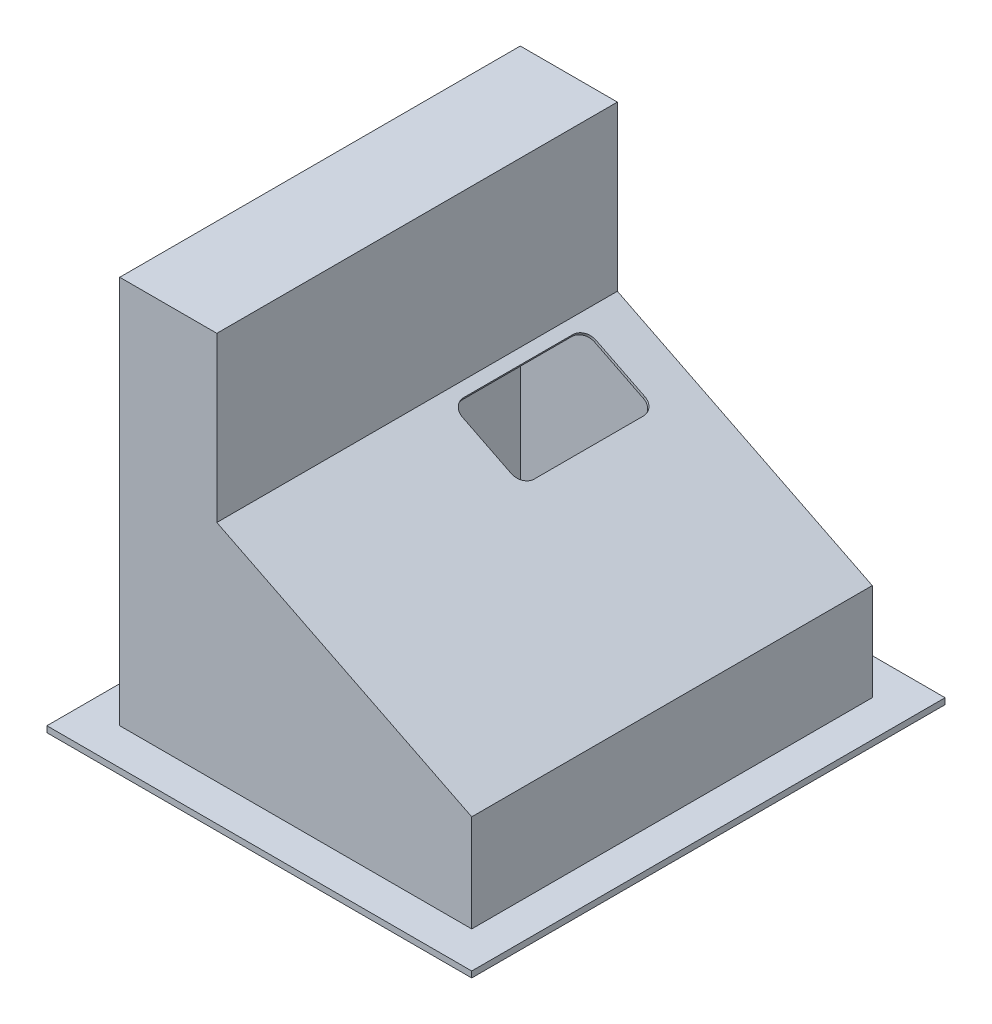
ISO-10303-21;
HEADER;
FILE_DESCRIPTION(('STEP AP214'),'2;1');
FILE_NAME('part.step','',(''),(''),'','','');
FILE_SCHEMA(('AUTOMOTIVE_DESIGN { 1 0 10303 214 1 1 1 1 }'));
ENDSEC;
DATA;
#1=APPLICATION_CONTEXT('core data for automotive mechanical design processes');
#2=APPLICATION_PROTOCOL_DEFINITION('international standard','automotive_design',2000,#1);
#3=PRODUCT_CONTEXT('',#1,'mechanical');
#4=PRODUCT('Part','Part','',(#3));
#5=PRODUCT_RELATED_PRODUCT_CATEGORY('part','',(#4));
#6=PRODUCT_DEFINITION_FORMATION('','',#4);
#7=PRODUCT_DEFINITION_CONTEXT('part definition',#1,'design');
#8=PRODUCT_DEFINITION('design','',#6,#7);
#9=PRODUCT_DEFINITION_SHAPE('','',#8);
#10=(LENGTH_UNIT() NAMED_UNIT(*) SI_UNIT(.MILLI.,.METRE.));
#11=(NAMED_UNIT(*) PLANE_ANGLE_UNIT() SI_UNIT($,.RADIAN.));
#12=(NAMED_UNIT(*) SI_UNIT($,.STERADIAN.) SOLID_ANGLE_UNIT());
#13=UNCERTAINTY_MEASURE_WITH_UNIT(LENGTH_MEASURE(1.E-05),#10,'distance_accuracy_value','');
#14=(GEOMETRIC_REPRESENTATION_CONTEXT(3) GLOBAL_UNCERTAINTY_ASSIGNED_CONTEXT((#13)) GLOBAL_UNIT_ASSIGNED_CONTEXT((#10,
#11,#12)) REPRESENTATION_CONTEXT('',''));
#15=CARTESIAN_POINT('',(0.,0.,0.));
#16=DIRECTION('',(0.,0.,1.));
#17=DIRECTION('',(1.,0.,0.));
#18=AXIS2_PLACEMENT_3D('',#15,#16,#17);
#19=CARTESIAN_POINT('',(33.3375,58.7375,101.6));
#20=DIRECTION('',(0.447213595499958,0.894427190999916,0.));
#21=DIRECTION('',(-0.894427190999916,0.447213595499958,0.));
#22=AXIS2_PLACEMENT_3D('',#19,#20,#21);
#23=PLANE('',#22);
#24=DIRECTION('',(0.,0.,1.));
#25=VECTOR('',#24,1.);
#26=CARTESIAN_POINT('',(37.2620158285617,56.7752420857191,101.6));
#27=LINE('',#26,#25);
#28=CARTESIAN_POINT('',(37.2620158285618,56.7752420857191,12.7));
#29=VERTEX_POINT('',#28);
#30=CARTESIAN_POINT('',(37.2620158285618,56.7752420857191,41.275));
#31=VERTEX_POINT('',#30);
#32=EDGE_CURVE('E273',#29,#31,#27,.T.);
#33=ORIENTED_EDGE('',*,*,#32,.T.);
#34=CARTESIAN_POINT('',(40.1018221599866,55.3553389200067,41.275));
#35=DIRECTION('',(0.447213595499958,0.894427190999916,0.));
#36=DIRECTION('',(-0.894427190999916,0.447213595499958,0.));
#37=AXIS2_PLACEMENT_3D('',#34,#35,#36);
#38=CIRCLE('',#37,3.17500000000007);
#39=CARTESIAN_POINT('',(40.1018221599866,55.3553389200067,44.45));
#40=VERTEX_POINT('',#39);
#41=EDGE_CURVE('E270',#31,#40,#38,.T.);
#42=ORIENTED_EDGE('',*,*,#41,.T.);
#43=DIRECTION('',(0.894427190999916,-0.447213595499958,0.));
#44=VECTOR('',#43,1.);
#45=CARTESIAN_POINT('',(33.3374999999998,58.7375000000001,44.4500000000001));
#46=LINE('',#45,#44);
#47=CARTESIAN_POINT('',(52.8809506513979,48.9657746743011,44.45));
#48=VERTEX_POINT('',#47);
#49=EDGE_CURVE('E278',#40,#48,#46,.T.);
#50=ORIENTED_EDGE('',*,*,#49,.T.);
#51=CARTESIAN_POINT('',(52.8809506513979,48.9657746743011,41.275));
#52=DIRECTION('',(0.447213595499958,0.894427190999916,0.));
#53=DIRECTION('',(-0.894427190999916,0.447213595499958,0.));
#54=AXIS2_PLACEMENT_3D('',#51,#52,#53);
#55=CIRCLE('',#54,3.17500000000001);
#56=CARTESIAN_POINT('',(55.7207569828226,47.5458715085887,41.275));
#57=VERTEX_POINT('',#56);
#58=EDGE_CURVE('E276',#48,#57,#55,.T.);
#59=ORIENTED_EDGE('',*,*,#58,.T.);
#60=DIRECTION('',(0.,0.,-1.));
#61=VECTOR('',#60,1.);
#62=CARTESIAN_POINT('',(55.7207569828226,47.5458715085887,101.6));
#63=LINE('',#62,#61);
#64=CARTESIAN_POINT('',(55.7207569828226,47.5458715085887,12.7));
#65=VERTEX_POINT('',#64);
#66=EDGE_CURVE('E213',#57,#65,#63,.T.);
#67=ORIENTED_EDGE('',*,*,#66,.T.);
#68=CARTESIAN_POINT('',(52.8809506513979,48.9657746743011,12.7));
#69=DIRECTION('',(0.447213595499958,0.894427190999916,0.));
#70=DIRECTION('',(-0.894427190999916,0.447213595499958,0.));
#71=AXIS2_PLACEMENT_3D('',#68,#69,#70);
#72=CIRCLE('',#71,3.17500000000001);
#73=CARTESIAN_POINT('',(52.8809506513979,48.9657746743011,9.525));
#74=VERTEX_POINT('',#73);
#75=EDGE_CURVE('E250',#65,#74,#72,.T.);
#76=ORIENTED_EDGE('',*,*,#75,.T.);
#77=DIRECTION('',(-0.894427190999916,0.447213595499958,0.));
#78=VECTOR('',#77,1.);
#79=CARTESIAN_POINT('',(33.3375,58.7375,9.52500000000001));
#80=LINE('',#79,#78);
#81=CARTESIAN_POINT('',(40.1018221599866,55.3553389200067,9.525));
#82=VERTEX_POINT('',#81);
#83=EDGE_CURVE('E264',#74,#82,#80,.T.);
#84=ORIENTED_EDGE('',*,*,#83,.T.);
#85=CARTESIAN_POINT('',(40.1018221599866,55.3553389200067,12.7));
#86=DIRECTION('',(0.447213595499958,0.894427190999916,0.));
#87=DIRECTION('',(-0.894427190999916,0.447213595499958,0.));
#88=AXIS2_PLACEMENT_3D('',#85,#86,#87);
#89=CIRCLE('',#88,3.175);
#90=EDGE_CURVE('E267',#82,#29,#89,.T.);
#91=ORIENTED_EDGE('',*,*,#90,.T.);
#92=EDGE_LOOP('',(#33,#42,#50,#59,#67,#76,#84,#91));
#93=FACE_BOUND('',#92,.T.);
#94=DIRECTION('',(0.,0.,-1.));
#95=VECTOR('',#94,1.);
#96=CARTESIAN_POINT('',(97.8375144127702,26.4874927936149,101.6));
#97=LINE('',#96,#95);
#98=CARTESIAN_POINT('',(97.8375144127702,26.4874927936149,101.6));
#99=VERTEX_POINT('',#98);
#100=CARTESIAN_POINT('',(97.8375144127702,26.4874927936149,0.));
#101=VERTEX_POINT('',#100);
#102=EDGE_CURVE('E287',#99,#101,#97,.T.);
#103=ORIENTED_EDGE('',*,*,#102,.F.);
#104=DIRECTION('',(0.894427190999916,-0.447213595499958,0.));
#105=VECTOR('',#104,1.);
#106=CARTESIAN_POINT('',(33.3375,58.7375,101.6));
#107=LINE('',#106,#105);
#108=CARTESIAN_POINT('',(33.3375,58.7375,101.6));
#109=VERTEX_POINT('',#108);
#110=EDGE_CURVE('E456',#109,#99,#107,.T.);
#111=ORIENTED_EDGE('',*,*,#110,.F.);
#112=DIRECTION('',(0.,0.,-1.));
#113=VECTOR('',#112,1.);
#114=CARTESIAN_POINT('',(33.3375,58.7375,101.6));
#115=LINE('',#114,#113);
#116=CARTESIAN_POINT('',(33.3375,58.7375,0.));
#117=VERTEX_POINT('',#116);
#118=EDGE_CURVE('E466',#109,#117,#115,.T.);
#119=ORIENTED_EDGE('',*,*,#118,.T.);
#120=DIRECTION('',(0.894427190999916,-0.447213595499958,0.));
#121=VECTOR('',#120,1.);
#122=CARTESIAN_POINT('',(33.3375,58.7375,0.));
#123=LINE('',#122,#121);
#124=EDGE_CURVE('E366',#117,#101,#123,.T.);
#125=ORIENTED_EDGE('',*,*,#124,.T.);
#126=EDGE_LOOP('',(#103,#111,#119,#125));
#127=FACE_BOUND('',#126,.T.);
#128=ADVANCED_FACE('F29',(#93,#127),#23,.F.);
#129=CARTESIAN_POINT('',(0.,0.,101.6));
#130=DIRECTION('',(0.,0.,-1.));
#131=DIRECTION('',(-1.,0.,0.));
#132=AXIS2_PLACEMENT_3D('',#129,#130,#131);
#133=PLANE('',#132);
#134=ORIENTED_EDGE('',*,*,#110,.T.);
#135=DIRECTION('',(0.447213595499958,0.894427190999916,0.));
#136=VECTOR('',#135,1.);
#137=CARTESIAN_POINT('',(86.4782890870712,3.76904214221704,101.6));
#138=LINE('',#137,#136);
#139=CARTESIAN_POINT('',(86.4782890870712,3.76904214221704,101.6));
#140=VERTEX_POINT('',#139);
#141=EDGE_CURVE('E309',#140,#99,#138,.T.);
#142=ORIENTED_EDGE('',*,*,#141,.F.);
#143=DIRECTION('',(-0.894427190999916,0.447213595499958,0.));
#144=VECTOR('',#143,1.);
#145=CARTESIAN_POINT('',(88.6532746743011,2.68154934860213,101.6));
#146=LINE('',#145,#144);
#147=CARTESIAN_POINT('',(88.6532746743011,2.68154934860212,101.6));
#148=VERTEX_POINT('',#147);
#149=EDGE_CURVE('E290',#148,#140,#146,.T.);
#150=ORIENTED_EDGE('',*,*,#149,.F.);
#151=DIRECTION('',(0.447213595499958,0.894427190999916,0.));
#152=VECTOR('',#151,1.);
#153=CARTESIAN_POINT('',(88.6532746743011,2.68154934860213,101.6));
#154=LINE('',#153,#152);
#155=CARTESIAN_POINT('',(100.0125,25.4,101.6));
#156=VERTEX_POINT('',#155);
#157=EDGE_CURVE('E302',#148,#156,#154,.T.);
#158=ORIENTED_EDGE('',*,*,#157,.T.);
#159=DIRECTION('',(0.,-1.,0.));
#160=VECTOR('',#159,1.);
#161=CARTESIAN_POINT('',(100.0125,25.4,101.6));
#162=LINE('',#161,#160);
#163=CARTESIAN_POINT('',(100.0125,-1.58750000000003,101.6));
#164=VERTEX_POINT('',#163);
#165=EDGE_CURVE('E451',#156,#164,#162,.T.);
#166=ORIENTED_EDGE('',*,*,#165,.T.);
#167=DIRECTION('',(1.,0.,0.));
#168=VECTOR('',#167,1.);
#169=CARTESIAN_POINT('',(111.125,-1.58750000000003,101.6));
#170=LINE('',#169,#168);
#171=CARTESIAN_POINT('',(11.1125,-1.5875,101.6));
#172=VERTEX_POINT('',#171);
#173=EDGE_CURVE('E352',#172,#164,#170,.T.);
#174=ORIENTED_EDGE('',*,*,#173,.F.);
#175=DIRECTION('',(0.,1.,0.));
#176=VECTOR('',#175,1.);
#177=CARTESIAN_POINT('',(11.1125,-1.5875,101.6));
#178=LINE('',#177,#176);
#179=CARTESIAN_POINT('',(11.1125,100.0125,101.6));
#180=VERTEX_POINT('',#179);
#181=EDGE_CURVE('E378',#172,#180,#178,.T.);
#182=ORIENTED_EDGE('',*,*,#181,.T.);
#183=DIRECTION('',(1.,0.,0.));
#184=VECTOR('',#183,1.);
#185=CARTESIAN_POINT('',(11.1125,100.0125,101.6));
#186=LINE('',#185,#184);
#187=CARTESIAN_POINT('',(33.3375,100.0125,101.6));
#188=VERTEX_POINT('',#187);
#189=EDGE_CURVE('E372',#180,#188,#186,.T.);
#190=ORIENTED_EDGE('',*,*,#189,.T.);
#191=DIRECTION('',(0.,-1.,0.));
#192=VECTOR('',#191,1.);
#193=CARTESIAN_POINT('',(33.3375,100.0125,101.6));
#194=LINE('',#193,#192);
#195=EDGE_CURVE('E510',#188,#109,#194,.T.);
#196=ORIENTED_EDGE('',*,*,#195,.T.);
#197=EDGE_LOOP('',(#134,#142,#150,#158,#166,#174,#182,#190,#196));
#198=FACE_BOUND('',#197,.T.);
#199=ADVANCED_FACE('F516',(#198),#133,.T.);
#200=CARTESIAN_POINT('',(34.925,-1.58750000000005,0.));
#201=DIRECTION('',(0.,0.,1.));
#202=DIRECTION('',(1.,0.,0.));
#203=AXIS2_PLACEMENT_3D('',#200,#201,#202);
#204=PLANE('',#203);
#205=DIRECTION('',(0.894427190999916,-0.447213595499958,0.));
#206=VECTOR('',#205,1.);
#207=CARTESIAN_POINT('',(86.4782890870712,3.76904214221704,0.));
#208=LINE('',#207,#206);
#209=CARTESIAN_POINT('',(86.4782890870712,3.76904214221704,0.));
#210=VERTEX_POINT('',#209);
#211=CARTESIAN_POINT('',(88.6532746743011,2.68154934860213,0.));
#212=VERTEX_POINT('',#211);
#213=EDGE_CURVE('E296',#210,#212,#208,.T.);
#214=ORIENTED_EDGE('',*,*,#213,.F.);
#215=DIRECTION('',(0.447213595499958,0.894427190999916,0.));
#216=VECTOR('',#215,1.);
#217=CARTESIAN_POINT('',(86.4782890870712,3.76904214221704,0.));
#218=LINE('',#217,#216);
#219=EDGE_CURVE('E307',#210,#101,#218,.T.);
#220=ORIENTED_EDGE('',*,*,#219,.T.);
#221=ORIENTED_EDGE('',*,*,#124,.F.);
#222=DIRECTION('',(0.,-1.,0.));
#223=VECTOR('',#222,1.);
#224=CARTESIAN_POINT('',(33.3375,100.0125,0.));
#225=LINE('',#224,#223);
#226=CARTESIAN_POINT('',(33.3375,100.0125,0.));
#227=VERTEX_POINT('',#226);
#228=EDGE_CURVE('E362',#227,#117,#225,.T.);
#229=ORIENTED_EDGE('',*,*,#228,.F.);
#230=DIRECTION('',(1.,0.,0.));
#231=VECTOR('',#230,1.);
#232=CARTESIAN_POINT('',(11.1125,100.0125,0.));
#233=LINE('',#232,#231);
#234=CARTESIAN_POINT('',(11.1125,100.0125,0.));
#235=VERTEX_POINT('',#234);
#236=EDGE_CURVE('E359',#235,#227,#233,.T.);
#237=ORIENTED_EDGE('',*,*,#236,.F.);
#238=DIRECTION('',(0.,1.,0.));
#239=VECTOR('',#238,1.);
#240=CARTESIAN_POINT('',(11.1125,-1.5875,0.));
#241=LINE('',#240,#239);
#242=CARTESIAN_POINT('',(11.1125,-1.58750000000005,0.));
#243=VERTEX_POINT('',#242);
#244=EDGE_CURVE('E363',#243,#235,#241,.T.);
#245=ORIENTED_EDGE('',*,*,#244,.F.);
#246=DIRECTION('',(-1.,0.,0.));
#247=VECTOR('',#246,1.);
#248=CARTESIAN_POINT('',(0.,-1.58750000000005,0.));
#249=LINE('',#248,#247);
#250=CARTESIAN_POINT('',(100.0125,-1.58750000000003,0.));
#251=VERTEX_POINT('',#250);
#252=EDGE_CURVE('E336',#251,#243,#249,.T.);
#253=ORIENTED_EDGE('',*,*,#252,.F.);
#254=DIRECTION('',(0.,-1.,0.));
#255=VECTOR('',#254,1.);
#256=CARTESIAN_POINT('',(100.0125,25.4,0.));
#257=LINE('',#256,#255);
#258=CARTESIAN_POINT('',(100.0125,25.4,0.));
#259=VERTEX_POINT('',#258);
#260=EDGE_CURVE('E369',#259,#251,#257,.T.);
#261=ORIENTED_EDGE('',*,*,#260,.F.);
#262=DIRECTION('',(0.447213595499958,0.894427190999916,0.));
#263=VECTOR('',#262,1.);
#264=CARTESIAN_POINT('',(88.6532746743011,2.68154934860213,0.));
#265=LINE('',#264,#263);
#266=EDGE_CURVE('E304',#212,#259,#265,.T.);
#267=ORIENTED_EDGE('',*,*,#266,.F.);
#268=EDGE_LOOP('',(#214,#220,#221,#229,#237,#245,#253,#261,#267));
#269=FACE_BOUND('',#268,.T.);
#270=ADVANCED_FACE('F488',(#269),#204,.T.);
#271=CARTESIAN_POINT('',(34.925,-1.58750000000005,-1.5875));
#272=DIRECTION('',(0.,0.,1.));
#273=DIRECTION('',(1.,0.,0.));
#274=AXIS2_PLACEMENT_3D('',#271,#272,#273);
#275=PLANE('',#274);
#276=DIRECTION('',(1.,0.,0.));
#277=VECTOR('',#276,1.);
#278=CARTESIAN_POINT('',(111.125,0.,-1.5875));
#279=LINE('',#278,#277);
#280=CARTESIAN_POINT('',(9.525,0.,-1.5875));
#281=VERTEX_POINT('',#280);
#282=CARTESIAN_POINT('',(101.6,0.,-1.5875));
#283=VERTEX_POINT('',#282);
#284=EDGE_CURVE('E11',#281,#283,#279,.T.);
#285=ORIENTED_EDGE('',*,*,#284,.F.);
#286=DIRECTION('',(0.,1.,0.));
#287=VECTOR('',#286,1.);
#288=CARTESIAN_POINT('',(9.525,101.6,-1.5875));
#289=LINE('',#288,#287);
#290=CARTESIAN_POINT('',(9.525,101.6,-1.5875));
#291=VERTEX_POINT('',#290);
#292=EDGE_CURVE('E345',#281,#291,#289,.T.);
#293=ORIENTED_EDGE('',*,*,#292,.T.);
#294=DIRECTION('',(1.,0.,0.));
#295=VECTOR('',#294,1.);
#296=CARTESIAN_POINT('',(34.925,101.6,-1.5875));
#297=LINE('',#296,#295);
#298=CARTESIAN_POINT('',(34.925,101.6,-1.5875));
#299=VERTEX_POINT('',#298);
#300=EDGE_CURVE('E339',#291,#299,#297,.T.);
#301=ORIENTED_EDGE('',*,*,#300,.T.);
#302=DIRECTION('',(0.,-1.,0.));
#303=VECTOR('',#302,1.);
#304=CARTESIAN_POINT('',(34.925,58.7375,-1.5875));
#305=LINE('',#304,#303);
#306=CARTESIAN_POINT('',(34.925,58.7375,-1.5875));
#307=VERTEX_POINT('',#306);
#308=EDGE_CURVE('E416',#299,#307,#305,.T.);
#309=ORIENTED_EDGE('',*,*,#308,.T.);
#310=DIRECTION('',(0.894427190999916,-0.447213595499958,0.));
#311=VECTOR('',#310,1.);
#312=CARTESIAN_POINT('',(101.6,25.4,-1.5875));
#313=LINE('',#312,#311);
#314=CARTESIAN_POINT('',(101.6,25.4,-1.5875));
#315=VERTEX_POINT('',#314);
#316=EDGE_CURVE('E346',#307,#315,#313,.T.);
#317=ORIENTED_EDGE('',*,*,#316,.T.);
#318=DIRECTION('',(0.,-1.,0.));
#319=VECTOR('',#318,1.);
#320=CARTESIAN_POINT('',(101.6,0.,-1.5875));
#321=LINE('',#320,#319);
#322=EDGE_CURVE('E357',#315,#283,#321,.T.);
#323=ORIENTED_EDGE('',*,*,#322,.T.);
#324=EDGE_LOOP('',(#285,#293,#301,#309,#317,#323));
#325=FACE_BOUND('',#324,.T.);
#326=ADVANCED_FACE('F422',(#325),#275,.F.);
#327=CARTESIAN_POINT('',(0.,0.,103.1875));
#328=DIRECTION('',(0.,0.,-1.));
#329=DIRECTION('',(-1.,0.,0.));
#330=AXIS2_PLACEMENT_3D('',#327,#328,#329);
#331=PLANE('',#330);
#332=DIRECTION('',(-1.,0.,0.));
#333=VECTOR('',#332,1.);
#334=CARTESIAN_POINT('',(0.,0.,103.1875));
#335=LINE('',#334,#333);
#336=CARTESIAN_POINT('',(101.6,0.,103.1875));
#337=VERTEX_POINT('',#336);
#338=CARTESIAN_POINT('',(9.525,0.,103.1875));
#339=VERTEX_POINT('',#338);
#340=EDGE_CURVE('E38',#337,#339,#335,.T.);
#341=ORIENTED_EDGE('',*,*,#340,.F.);
#342=DIRECTION('',(0.,1.,0.));
#343=VECTOR('',#342,1.);
#344=CARTESIAN_POINT('',(101.6,25.4,103.1875));
#345=LINE('',#344,#343);
#346=CARTESIAN_POINT('',(101.6,25.4,103.1875));
#347=VERTEX_POINT('',#346);
#348=EDGE_CURVE('E356',#337,#347,#345,.T.);
#349=ORIENTED_EDGE('',*,*,#348,.T.);
#350=DIRECTION('',(-0.894427190999916,0.447213595499958,0.));
#351=VECTOR('',#350,1.);
#352=CARTESIAN_POINT('',(34.925,58.7375,103.1875));
#353=LINE('',#352,#351);
#354=CARTESIAN_POINT('',(34.925,58.7375,103.1875));
#355=VERTEX_POINT('',#354);
#356=EDGE_CURVE('E349',#347,#355,#353,.T.);
#357=ORIENTED_EDGE('',*,*,#356,.T.);
#358=DIRECTION('',(0.,1.,0.));
#359=VECTOR('',#358,1.);
#360=CARTESIAN_POINT('',(34.925,101.6,103.1875));
#361=LINE('',#360,#359);
#362=CARTESIAN_POINT('',(34.925,101.6,103.1875));
#363=VERTEX_POINT('',#362);
#364=EDGE_CURVE('E921',#355,#363,#361,.T.);
#365=ORIENTED_EDGE('',*,*,#364,.T.);
#366=DIRECTION('',(-1.,0.,0.));
#367=VECTOR('',#366,1.);
#368=CARTESIAN_POINT('',(9.525,101.6,103.1875));
#369=LINE('',#368,#367);
#370=CARTESIAN_POINT('',(9.525,101.6,103.1875));
#371=VERTEX_POINT('',#370);
#372=EDGE_CURVE('E358',#363,#371,#369,.T.);
#373=ORIENTED_EDGE('',*,*,#372,.T.);
#374=DIRECTION('',(0.,-1.,0.));
#375=VECTOR('',#374,1.);
#376=CARTESIAN_POINT('',(9.525,0.,103.1875));
#377=LINE('',#376,#375);
#378=EDGE_CURVE('E393',#371,#339,#377,.T.);
#379=ORIENTED_EDGE('',*,*,#378,.T.);
#380=EDGE_LOOP('',(#341,#349,#357,#365,#373,#379));
#381=FACE_BOUND('',#380,.T.);
#382=ADVANCED_FACE('F532',(#381),#331,.F.);
#383=CARTESIAN_POINT('',(101.6,0.,101.6));
#384=DIRECTION('',(-1.,0.,0.));
#385=DIRECTION('',(0.,0.,1.));
#386=AXIS2_PLACEMENT_3D('',#383,#384,#385);
#387=PLANE('',#386);
#388=DIRECTION('',(0.,0.,-1.));
#389=VECTOR('',#388,1.);
#390=CARTESIAN_POINT('',(101.6,0.,101.6));
#391=LINE('',#390,#389);
#392=EDGE_CURVE('E385',#337,#283,#391,.T.);
#393=ORIENTED_EDGE('',*,*,#392,.T.);
#394=ORIENTED_EDGE('',*,*,#322,.F.);
#395=DIRECTION('',(0.,0.,-1.));
#396=VECTOR('',#395,1.);
#397=CARTESIAN_POINT('',(101.6,25.4,101.6));
#398=LINE('',#397,#396);
#399=EDGE_CURVE('E399',#347,#315,#398,.T.);
#400=ORIENTED_EDGE('',*,*,#399,.F.);
#401=ORIENTED_EDGE('',*,*,#348,.F.);
#402=EDGE_LOOP('',(#393,#394,#400,#401));
#403=FACE_BOUND('',#402,.T.);
#404=ADVANCED_FACE('F31',(#403),#387,.F.);
#405=CARTESIAN_POINT('',(101.6,25.4,101.6));
#406=DIRECTION('',(-0.447213595499958,-0.894427190999916,0.));
#407=DIRECTION('',(0.894427190999916,-0.447213595499958,0.));
#408=AXIS2_PLACEMENT_3D('',#405,#406,#407);
#409=PLANE('',#408);
#410=DIRECTION('',(0.894427190999916,-0.447213595499958,0.));
#411=VECTOR('',#410,1.);
#412=CARTESIAN_POINT('',(53.1984506513979,49.6007746743011,44.45));
#413=LINE('',#412,#411);
#414=CARTESIAN_POINT('',(40.4193221599866,55.9903389200067,44.45));
#415=VERTEX_POINT('',#414);
#416=CARTESIAN_POINT('',(53.1984506513979,49.6007746743011,44.45));
#417=VERTEX_POINT('',#416);
#418=EDGE_CURVE('E217',#415,#417,#413,.T.);
#419=ORIENTED_EDGE('',*,*,#418,.F.);
#420=CARTESIAN_POINT('',(40.4193221599866,55.9903389200067,41.275));
#421=DIRECTION('',(0.447213595499958,0.894427190999916,0.));
#422=DIRECTION('',(0.894427190999916,-0.447213595499958,0.));
#423=AXIS2_PLACEMENT_3D('',#420,#421,#422);
#424=CIRCLE('',#423,3.17500000000007);
#425=CARTESIAN_POINT('',(37.5795158285618,57.4102420857191,41.275));
#426=VERTEX_POINT('',#425);
#427=EDGE_CURVE('E245',#426,#415,#424,.T.);
#428=ORIENTED_EDGE('',*,*,#427,.F.);
#429=DIRECTION('',(0.,0.,1.));
#430=VECTOR('',#429,1.);
#431=CARTESIAN_POINT('',(37.5795158285618,57.4102420857191,41.275));
#432=LINE('',#431,#430);
#433=CARTESIAN_POINT('',(37.5795158285618,57.4102420857191,12.7));
#434=VERTEX_POINT('',#433);
#435=EDGE_CURVE('E242',#434,#426,#432,.T.);
#436=ORIENTED_EDGE('',*,*,#435,.F.);
#437=CARTESIAN_POINT('',(40.4193221599866,55.9903389200067,12.7));
#438=DIRECTION('',(0.447213595499958,0.894427190999916,0.));
#439=DIRECTION('',(0.894427190999916,-0.447213595499958,0.));
#440=AXIS2_PLACEMENT_3D('',#437,#438,#439);
#441=CIRCLE('',#440,3.175);
#442=CARTESIAN_POINT('',(40.4193221599866,55.9903389200067,9.525));
#443=VERTEX_POINT('',#442);
#444=EDGE_CURVE('E239',#443,#434,#441,.T.);
#445=ORIENTED_EDGE('',*,*,#444,.F.);
#446=DIRECTION('',(-0.894427190999916,0.447213595499958,0.));
#447=VECTOR('',#446,1.);
#448=CARTESIAN_POINT('',(40.4193221599866,55.9903389200067,9.525));
#449=LINE('',#448,#447);
#450=CARTESIAN_POINT('',(53.1984506513979,49.6007746743011,9.525));
#451=VERTEX_POINT('',#450);
#452=EDGE_CURVE('E234',#451,#443,#449,.T.);
#453=ORIENTED_EDGE('',*,*,#452,.F.);
#454=CARTESIAN_POINT('',(53.1984506513979,49.6007746743011,12.7));
#455=DIRECTION('',(0.447213595499958,0.894427190999916,0.));
#456=DIRECTION('',(-0.894427190999916,0.447213595499958,0.));
#457=AXIS2_PLACEMENT_3D('',#454,#455,#456);
#458=CIRCLE('',#457,3.17500000000001);
#459=CARTESIAN_POINT('',(56.0382569828226,48.1808715085887,12.7));
#460=VERTEX_POINT('',#459);
#461=EDGE_CURVE('E232',#460,#451,#458,.T.);
#462=ORIENTED_EDGE('',*,*,#461,.F.);
#463=DIRECTION('',(0.,0.,-1.));
#464=VECTOR('',#463,1.);
#465=CARTESIAN_POINT('',(56.0382569828226,48.1808715085887,12.7));
#466=LINE('',#465,#464);
#467=CARTESIAN_POINT('',(56.0382569828226,48.1808715085887,41.275));
#468=VERTEX_POINT('',#467);
#469=EDGE_CURVE('E54',#468,#460,#466,.T.);
#470=ORIENTED_EDGE('',*,*,#469,.F.);
#471=CARTESIAN_POINT('',(53.1984506513979,49.6007746743011,41.275));
#472=DIRECTION('',(0.447213595499958,0.894427190999916,0.));
#473=DIRECTION('',(-0.894427190999916,0.447213595499958,0.));
#474=AXIS2_PLACEMENT_3D('',#471,#472,#473);
#475=CIRCLE('',#474,3.17500000000001);
#476=EDGE_CURVE('E220',#417,#468,#475,.T.);
#477=ORIENTED_EDGE('',*,*,#476,.F.);
#478=EDGE_LOOP('',(#419,#428,#436,#445,#453,#462,#470,#477));
#479=FACE_BOUND('',#478,.T.);
#480=ORIENTED_EDGE('',*,*,#399,.T.);
#481=ORIENTED_EDGE('',*,*,#316,.F.);
#482=DIRECTION('',(0.,0.,-1.));
#483=VECTOR('',#482,1.);
#484=CARTESIAN_POINT('',(34.925,58.7375,101.6));
#485=LINE('',#484,#483);
#486=EDGE_CURVE('E437',#355,#307,#485,.T.);
#487=ORIENTED_EDGE('',*,*,#486,.F.);
#488=ORIENTED_EDGE('',*,*,#356,.F.);
#489=EDGE_LOOP('',(#480,#481,#487,#488));
#490=FACE_BOUND('',#489,.T.);
#491=ADVANCED_FACE('F229',(#479,#490),#409,.F.);
#492=CARTESIAN_POINT('',(34.925,101.6,101.6));
#493=DIRECTION('',(-1.,0.,0.));
#494=DIRECTION('',(0.,-1.,0.));
#495=AXIS2_PLACEMENT_3D('',#492,#493,#494);
#496=PLANE('',#495);
#497=ORIENTED_EDGE('',*,*,#486,.T.);
#498=ORIENTED_EDGE('',*,*,#308,.F.);
#499=DIRECTION('',(0.,0.,-1.));
#500=VECTOR('',#499,1.);
#501=CARTESIAN_POINT('',(34.925,101.6,101.6));
#502=LINE('',#501,#500);
#503=EDGE_CURVE('E435',#363,#299,#502,.T.);
#504=ORIENTED_EDGE('',*,*,#503,.F.);
#505=ORIENTED_EDGE('',*,*,#364,.F.);
#506=EDGE_LOOP('',(#497,#498,#504,#505));
#507=FACE_BOUND('',#506,.T.);
#508=ADVANCED_FACE('F562',(#507),#496,.F.);
#509=CARTESIAN_POINT('',(9.525,101.6,101.6));
#510=DIRECTION('',(0.,-1.,0.));
#511=DIRECTION('',(1.,0.,0.));
#512=AXIS2_PLACEMENT_3D('',#509,#510,#511);
#513=PLANE('',#512);
#514=ORIENTED_EDGE('',*,*,#503,.T.);
#515=ORIENTED_EDGE('',*,*,#300,.F.);
#516=DIRECTION('',(0.,0.,-1.));
#517=VECTOR('',#516,1.);
#518=CARTESIAN_POINT('',(9.525,101.6,101.6));
#519=LINE('',#518,#517);
#520=EDGE_CURVE('E389',#371,#291,#519,.T.);
#521=ORIENTED_EDGE('',*,*,#520,.F.);
#522=ORIENTED_EDGE('',*,*,#372,.F.);
#523=EDGE_LOOP('',(#514,#515,#521,#522));
#524=FACE_BOUND('',#523,.T.);
#525=ADVANCED_FACE('F559',(#524),#513,.F.);
#526=CARTESIAN_POINT('',(9.525,0.,101.6));
#527=DIRECTION('',(1.,0.,0.));
#528=DIRECTION('',(0.,0.,-1.));
#529=AXIS2_PLACEMENT_3D('',#526,#527,#528);
#530=PLANE('',#529);
#531=ORIENTED_EDGE('',*,*,#520,.T.);
#532=ORIENTED_EDGE('',*,*,#292,.F.);
#533=DIRECTION('',(0.,0.,-1.));
#534=VECTOR('',#533,1.);
#535=CARTESIAN_POINT('',(9.525,0.,101.6));
#536=LINE('',#535,#534);
#537=EDGE_CURVE('E386',#339,#281,#536,.T.);
#538=ORIENTED_EDGE('',*,*,#537,.F.);
#539=ORIENTED_EDGE('',*,*,#378,.F.);
#540=EDGE_LOOP('',(#531,#532,#538,#539));
#541=FACE_BOUND('',#540,.T.);
#542=ADVANCED_FACE('F431',(#541),#530,.F.);
#543=CARTESIAN_POINT('',(0.,0.,101.6));
#544=DIRECTION('',(0.,-1.,0.));
#545=DIRECTION('',(0.,0.,-1.));
#546=AXIS2_PLACEMENT_3D('',#543,#544,#545);
#547=PLANE('',#546);
#548=ORIENTED_EDGE('',*,*,#537,.T.);
#549=ORIENTED_EDGE('',*,*,#284,.T.);
#550=ORIENTED_EDGE('',*,*,#392,.F.);
#551=ORIENTED_EDGE('',*,*,#340,.T.);
#552=EDGE_LOOP('',(#548,#549,#550,#551));
#553=FACE_BOUND('',#552,.T.);
#554=DIRECTION('',(1.,0.,0.));
#555=VECTOR('',#554,1.);
#556=CARTESIAN_POINT('',(111.125,0.,-11.1125));
#557=LINE('',#556,#555);
#558=CARTESIAN_POINT('',(0.,0.,-11.1125));
#559=VERTEX_POINT('',#558);
#560=CARTESIAN_POINT('',(111.125,0.,-11.1125));
#561=VERTEX_POINT('',#560);
#562=EDGE_CURVE('E321',#559,#561,#557,.T.);
#563=ORIENTED_EDGE('',*,*,#562,.F.);
#564=DIRECTION('',(0.,0.,-1.));
#565=VECTOR('',#564,1.);
#566=CARTESIAN_POINT('',(0.,0.,101.6));
#567=LINE('',#566,#565);
#568=CARTESIAN_POINT('',(0.,0.,112.7125));
#569=VERTEX_POINT('',#568);
#570=EDGE_CURVE('E390',#569,#559,#567,.T.);
#571=ORIENTED_EDGE('',*,*,#570,.F.);
#572=DIRECTION('',(-1.,0.,0.));
#573=VECTOR('',#572,1.);
#574=CARTESIAN_POINT('',(0.,0.,112.7125));
#575=LINE('',#574,#573);
#576=CARTESIAN_POINT('',(111.125,0.,112.7125));
#577=VERTEX_POINT('',#576);
#578=EDGE_CURVE('E333',#577,#569,#575,.T.);
#579=ORIENTED_EDGE('',*,*,#578,.F.);
#580=DIRECTION('',(0.,0.,-1.));
#581=VECTOR('',#580,1.);
#582=CARTESIAN_POINT('',(111.125,0.,101.6));
#583=LINE('',#582,#581);
#584=EDGE_CURVE('E455',#577,#561,#583,.T.);
#585=ORIENTED_EDGE('',*,*,#584,.T.);
#586=EDGE_LOOP('',(#563,#571,#579,#585));
#587=FACE_BOUND('',#586,.T.);
#588=ADVANCED_FACE('F427',(#553,#587),#547,.F.);
#589=CARTESIAN_POINT('',(0.,0.,101.6));
#590=DIRECTION('',(1.,0.,0.));
#591=DIRECTION('',(0.,0.,-1.));
#592=AXIS2_PLACEMENT_3D('',#589,#590,#591);
#593=PLANE('',#592);
#594=ORIENTED_EDGE('',*,*,#570,.T.);
#595=DIRECTION('',(0.,1.,0.));
#596=VECTOR('',#595,1.);
#597=CARTESIAN_POINT('',(0.,0.,-11.1125));
#598=LINE('',#597,#596);
#599=CARTESIAN_POINT('',(0.,-1.5875,-11.1125));
#600=VERTEX_POINT('',#599);
#601=EDGE_CURVE('E318',#600,#559,#598,.T.);
#602=ORIENTED_EDGE('',*,*,#601,.F.);
#603=DIRECTION('',(0.,0.,-1.));
#604=VECTOR('',#603,1.);
#605=CARTESIAN_POINT('',(0.,-1.5875,101.6));
#606=LINE('',#605,#604);
#607=CARTESIAN_POINT('',(0.,-1.58750000000005,112.7125));
#608=VERTEX_POINT('',#607);
#609=EDGE_CURVE('E474',#608,#600,#606,.T.);
#610=ORIENTED_EDGE('',*,*,#609,.F.);
#611=DIRECTION('',(0.,-1.,0.));
#612=VECTOR('',#611,1.);
#613=CARTESIAN_POINT('',(0.,-1.58750000000005,112.7125));
#614=LINE('',#613,#612);
#615=EDGE_CURVE('E324',#569,#608,#614,.T.);
#616=ORIENTED_EDGE('',*,*,#615,.F.);
#617=EDGE_LOOP('',(#594,#602,#610,#616));
#618=FACE_BOUND('',#617,.T.);
#619=ADVANCED_FACE('F551',(#618),#593,.F.);
#620=CARTESIAN_POINT('',(11.1125,-1.5875,101.6));
#621=DIRECTION('',(-1.,0.,0.));
#622=DIRECTION('',(0.,0.,1.));
#623=AXIS2_PLACEMENT_3D('',#620,#621,#622);
#624=PLANE('',#623);
#625=ORIENTED_EDGE('',*,*,#244,.T.);
#626=DIRECTION('',(0.,0.,-1.));
#627=VECTOR('',#626,1.);
#628=CARTESIAN_POINT('',(11.1125,100.0125,101.6));
#629=LINE('',#628,#627);
#630=EDGE_CURVE('E472',#180,#235,#629,.T.);
#631=ORIENTED_EDGE('',*,*,#630,.F.);
#632=ORIENTED_EDGE('',*,*,#181,.F.);
#633=DIRECTION('',(0.,0.,-1.));
#634=VECTOR('',#633,1.);
#635=CARTESIAN_POINT('',(11.1125,-1.5875,101.6));
#636=LINE('',#635,#634);
#637=EDGE_CURVE('E457',#172,#243,#636,.T.);
#638=ORIENTED_EDGE('',*,*,#637,.T.);
#639=EDGE_LOOP('',(#625,#631,#632,#638));
#640=FACE_BOUND('',#639,.T.);
#641=ADVANCED_FACE('F482',(#640),#624,.F.);
#642=CARTESIAN_POINT('',(11.1125,100.0125,101.6));
#643=DIRECTION('',(0.,1.,0.));
#644=DIRECTION('',(0.,0.,1.));
#645=AXIS2_PLACEMENT_3D('',#642,#643,#644);
#646=PLANE('',#645);
#647=ORIENTED_EDGE('',*,*,#236,.T.);
#648=DIRECTION('',(0.,0.,-1.));
#649=VECTOR('',#648,1.);
#650=CARTESIAN_POINT('',(33.3375,100.0125,101.6));
#651=LINE('',#650,#649);
#652=EDGE_CURVE('E469',#188,#227,#651,.T.);
#653=ORIENTED_EDGE('',*,*,#652,.F.);
#654=ORIENTED_EDGE('',*,*,#189,.F.);
#655=ORIENTED_EDGE('',*,*,#630,.T.);
#656=EDGE_LOOP('',(#647,#653,#654,#655));
#657=FACE_BOUND('',#656,.T.);
#658=ADVANCED_FACE('F513',(#657),#646,.F.);
#659=CARTESIAN_POINT('',(33.3375,100.0125,101.6));
#660=DIRECTION('',(1.,0.,0.));
#661=DIRECTION('',(0.,1.,0.));
#662=AXIS2_PLACEMENT_3D('',#659,#660,#661);
#663=PLANE('',#662);
#664=ORIENTED_EDGE('',*,*,#228,.T.);
#665=ORIENTED_EDGE('',*,*,#118,.F.);
#666=ORIENTED_EDGE('',*,*,#195,.F.);
#667=ORIENTED_EDGE('',*,*,#652,.T.);
#668=EDGE_LOOP('',(#664,#665,#666,#667));
#669=FACE_BOUND('',#668,.T.);
#670=ADVANCED_FACE('F509',(#669),#663,.F.);
#671=CARTESIAN_POINT('',(100.0125,25.4,101.6));
#672=DIRECTION('',(1.,0.,0.));
#673=DIRECTION('',(0.,1.,0.));
#674=AXIS2_PLACEMENT_3D('',#671,#672,#673);
#675=PLANE('',#674);
#676=ORIENTED_EDGE('',*,*,#260,.T.);
#677=DIRECTION('',(0.,0.,-1.));
#678=VECTOR('',#677,1.);
#679=CARTESIAN_POINT('',(100.0125,-1.58749999999998,101.6));
#680=LINE('',#679,#678);
#681=EDGE_CURVE('E444',#164,#251,#680,.T.);
#682=ORIENTED_EDGE('',*,*,#681,.F.);
#683=ORIENTED_EDGE('',*,*,#165,.F.);
#684=DIRECTION('',(0.,0.,-1.));
#685=VECTOR('',#684,1.);
#686=CARTESIAN_POINT('',(100.0125,25.4,101.6));
#687=LINE('',#686,#685);
#688=EDGE_CURVE('E447',#156,#259,#687,.T.);
#689=ORIENTED_EDGE('',*,*,#688,.T.);
#690=EDGE_LOOP('',(#676,#682,#683,#689));
#691=FACE_BOUND('',#690,.T.);
#692=ADVANCED_FACE('F490',(#691),#675,.F.);
#693=CARTESIAN_POINT('',(100.0125,-1.58749999999998,101.6));
#694=DIRECTION('',(0.,1.,0.));
#695=DIRECTION('',(-1.,0.,0.));
#696=AXIS2_PLACEMENT_3D('',#693,#694,#695);
#697=PLANE('',#696);
#698=ORIENTED_EDGE('',*,*,#609,.T.);
#699=DIRECTION('',(-1.,0.,0.));
#700=VECTOR('',#699,1.);
#701=CARTESIAN_POINT('',(0.,-1.5875,-11.1125));
#702=LINE('',#701,#700);
#703=CARTESIAN_POINT('',(111.125,-1.58750000000003,-11.1125));
#704=VERTEX_POINT('',#703);
#705=EDGE_CURVE('E315',#704,#600,#702,.T.);
#706=ORIENTED_EDGE('',*,*,#705,.F.);
#707=DIRECTION('',(0.,0.,-1.));
#708=VECTOR('',#707,1.);
#709=CARTESIAN_POINT('',(111.125,-1.58750000000003,101.6));
#710=LINE('',#709,#708);
#711=CARTESIAN_POINT('',(111.125,-1.58750000000003,112.7125));
#712=VERTEX_POINT('',#711);
#713=EDGE_CURVE('E448',#712,#704,#710,.T.);
#714=ORIENTED_EDGE('',*,*,#713,.F.);
#715=DIRECTION('',(1.,0.,0.));
#716=VECTOR('',#715,1.);
#717=CARTESIAN_POINT('',(111.125,-1.58750000000003,112.7125));
#718=LINE('',#717,#716);
#719=EDGE_CURVE('E327',#608,#712,#718,.T.);
#720=ORIENTED_EDGE('',*,*,#719,.F.);
#721=EDGE_LOOP('',(#698,#706,#714,#720));
#722=FACE_BOUND('',#721,.T.);
#723=ORIENTED_EDGE('',*,*,#681,.T.);
#724=ORIENTED_EDGE('',*,*,#252,.T.);
#725=ORIENTED_EDGE('',*,*,#637,.F.);
#726=ORIENTED_EDGE('',*,*,#173,.T.);
#727=EDGE_LOOP('',(#723,#724,#725,#726));
#728=FACE_BOUND('',#727,.T.);
#729=ADVANCED_FACE('F486',(#722,#728),#697,.F.);
#730=CARTESIAN_POINT('',(111.125,-1.58750000000003,101.6));
#731=DIRECTION('',(-1.,0.,0.));
#732=DIRECTION('',(0.,-1.,0.));
#733=AXIS2_PLACEMENT_3D('',#730,#731,#732);
#734=PLANE('',#733);
#735=ORIENTED_EDGE('',*,*,#713,.T.);
#736=DIRECTION('',(0.,-1.,0.));
#737=VECTOR('',#736,1.);
#738=CARTESIAN_POINT('',(111.125,-1.58750000000003,-11.1125));
#739=LINE('',#738,#737);
#740=EDGE_CURVE('E312',#561,#704,#739,.T.);
#741=ORIENTED_EDGE('',*,*,#740,.F.);
#742=ORIENTED_EDGE('',*,*,#584,.F.);
#743=DIRECTION('',(0.,1.,0.));
#744=VECTOR('',#743,1.);
#745=CARTESIAN_POINT('',(111.125,0.,112.7125));
#746=LINE('',#745,#744);
#747=EDGE_CURVE('E330',#712,#577,#746,.T.);
#748=ORIENTED_EDGE('',*,*,#747,.F.);
#749=EDGE_LOOP('',(#735,#741,#742,#748));
#750=FACE_BOUND('',#749,.T.);
#751=ADVANCED_FACE('F536',(#750),#734,.F.);
#752=CARTESIAN_POINT('',(0.,0.,112.7125));
#753=DIRECTION('',(0.,0.,-1.));
#754=DIRECTION('',(-1.,0.,0.));
#755=AXIS2_PLACEMENT_3D('',#752,#753,#754);
#756=PLANE('',#755);
#757=ORIENTED_EDGE('',*,*,#615,.T.);
#758=ORIENTED_EDGE('',*,*,#719,.T.);
#759=ORIENTED_EDGE('',*,*,#747,.T.);
#760=ORIENTED_EDGE('',*,*,#578,.T.);
#761=EDGE_LOOP('',(#757,#758,#759,#760));
#762=FACE_BOUND('',#761,.T.);
#763=ADVANCED_FACE('F539',(#762),#756,.F.);
#764=CARTESIAN_POINT('',(111.125,0.,-11.1125));
#765=DIRECTION('',(0.,0.,1.));
#766=DIRECTION('',(1.,0.,0.));
#767=AXIS2_PLACEMENT_3D('',#764,#765,#766);
#768=PLANE('',#767);
#769=ORIENTED_EDGE('',*,*,#740,.T.);
#770=ORIENTED_EDGE('',*,*,#705,.T.);
#771=ORIENTED_EDGE('',*,*,#601,.T.);
#772=ORIENTED_EDGE('',*,*,#562,.T.);
#773=EDGE_LOOP('',(#769,#770,#771,#772));
#774=FACE_BOUND('',#773,.T.);
#775=ADVANCED_FACE('F608',(#774),#768,.F.);
#776=CARTESIAN_POINT('',(86.4782890870712,3.76904214221704,101.6));
#777=DIRECTION('',(0.894427190999916,-0.447213595499958,0.));
#778=DIRECTION('',(0.447213595499958,0.894427190999916,0.));
#779=AXIS2_PLACEMENT_3D('',#776,#777,#778);
#780=PLANE('',#779);
#781=ORIENTED_EDGE('',*,*,#102,.T.);
#782=ORIENTED_EDGE('',*,*,#219,.F.);
#783=DIRECTION('',(0.,0.,-1.));
#784=VECTOR('',#783,1.);
#785=CARTESIAN_POINT('',(86.4782890870712,3.76904214221704,101.6));
#786=LINE('',#785,#784);
#787=EDGE_CURVE('E293',#140,#210,#786,.T.);
#788=ORIENTED_EDGE('',*,*,#787,.F.);
#789=ORIENTED_EDGE('',*,*,#141,.T.);
#790=EDGE_LOOP('',(#781,#782,#788,#789));
#791=FACE_BOUND('',#790,.T.);
#792=ADVANCED_FACE('F502',(#791),#780,.F.);
#793=CARTESIAN_POINT('',(88.6532746743011,2.68154934860213,0.));
#794=DIRECTION('',(-0.894427190999916,0.447213595499958,0.));
#795=DIRECTION('',(-0.447213595499958,-0.894427190999916,0.));
#796=AXIS2_PLACEMENT_3D('',#793,#794,#795);
#797=PLANE('',#796);
#798=CARTESIAN_POINT('',(92.9420530551456,11.2591061102913,50.8));
#799=DIRECTION('',(0.894427190999916,-0.447213595499958,0.));
#800=DIRECTION('',(0.447213595499958,0.894427190999916,0.));
#801=AXIS2_PLACEMENT_3D('',#798,#799,#800);
#802=CIRCLE('',#801,2.5);
#803=CARTESIAN_POINT('',(94.0600870438955,13.4951740877911,50.8));
#804=VERTEX_POINT('',#803);
#805=EDGE_CURVE('E281',#804,#804,#802,.T.);
#806=ORIENTED_EDGE('',*,*,#805,.F.);
#807=EDGE_LOOP('',(#806));
#808=FACE_BOUND('',#807,.T.);
#809=ORIENTED_EDGE('',*,*,#688,.F.);
#810=ORIENTED_EDGE('',*,*,#157,.F.);
#811=DIRECTION('',(0.,0.,1.));
#812=VECTOR('',#811,1.);
#813=CARTESIAN_POINT('',(88.6532746743011,2.68154934860213,0.));
#814=LINE('',#813,#812);
#815=EDGE_CURVE('E299',#212,#148,#814,.T.);
#816=ORIENTED_EDGE('',*,*,#815,.F.);
#817=ORIENTED_EDGE('',*,*,#266,.T.);
#818=EDGE_LOOP('',(#809,#810,#816,#817));
#819=FACE_BOUND('',#818,.T.);
#820=ADVANCED_FACE('F496',(#808,#819),#797,.F.);
#821=CARTESIAN_POINT('',(86.4782890870712,3.76904214221704,101.6));
#822=DIRECTION('',(-0.447213595499958,-0.894427190999916,0.));
#823=DIRECTION('',(0.894427190999916,-0.447213595499958,0.));
#824=AXIS2_PLACEMENT_3D('',#821,#822,#823);
#825=PLANE('',#824);
#826=ORIENTED_EDGE('',*,*,#149,.T.);
#827=ORIENTED_EDGE('',*,*,#787,.T.);
#828=ORIENTED_EDGE('',*,*,#213,.T.);
#829=ORIENTED_EDGE('',*,*,#815,.T.);
#830=EDGE_LOOP('',(#826,#827,#828,#829));
#831=FACE_BOUND('',#830,.T.);
#832=ADVANCED_FACE('F498',(#831),#825,.T.);
#833=CARTESIAN_POINT('',(91.5221498894333,11.9690576931475,50.8));
#834=DIRECTION('',(0.894427190999916,-0.447213595499958,0.));
#835=DIRECTION('',(0.447213595499958,0.894427190999916,0.));
#836=AXIS2_PLACEMENT_3D('',#833,#834,#835);
#837=CYLINDRICAL_SURFACE('',#836,2.5);
#838=CARTESIAN_POINT('',(91.5221498894333,11.9690576931475,50.8));
#839=DIRECTION('',(0.894427190999916,-0.447213595499958,0.));
#840=DIRECTION('',(0.447213595499958,0.894427190999916,0.));
#841=AXIS2_PLACEMENT_3D('',#838,#839,#840);
#842=CIRCLE('',#841,2.5);
#843=CARTESIAN_POINT('',(92.6401838781832,14.2051256706473,50.8));
#844=VERTEX_POINT('',#843);
#845=EDGE_CURVE('E284',#844,#844,#842,.T.);
#846=CARTESIAN_POINT('',(92.6401838781832,14.2051256706473,50.8));
#847=CARTESIAN_POINT('',(92.6549745361593,14.1977303416592,50.8));
#848=CARTESIAN_POINT('',(92.6697651941355,14.1903350126711,50.8));
#849=CARTESIAN_POINT('',(92.6993465100879,14.1755443546949,50.8));
#850=CARTESIAN_POINT('',(92.714137168064,14.1681490257069,50.8));
#851=CARTESIAN_POINT('',(92.7437184840164,14.1533583677307,50.8));
#852=CARTESIAN_POINT('',(92.7585091419925,14.1459630387426,50.8));
#853=CARTESIAN_POINT('',(92.7880904579449,14.1311723807664,50.8));
#854=CARTESIAN_POINT('',(92.802881115921,14.1237770517784,50.8));
#855=CARTESIAN_POINT('',(92.8324624318734,14.1089863938022,50.8));
#856=CARTESIAN_POINT('',(92.8472530898495,14.1015910648141,50.8));
#857=CARTESIAN_POINT('',(92.8768344058019,14.0868004068379,50.8));
#858=CARTESIAN_POINT('',(92.8916250637781,14.0794050778498,50.8));
#859=CARTESIAN_POINT('',(92.9212063797304,14.0646144198737,50.8));
#860=CARTESIAN_POINT('',(92.9359970377066,14.0572190908856,50.8));
#861=CARTESIAN_POINT('',(92.9655783536589,14.0424284329094,50.8));
#862=CARTESIAN_POINT('',(92.9803690116351,14.0350331039213,50.8));
#863=CARTESIAN_POINT('',(93.0099503275874,14.0202424459452,50.8));
#864=CARTESIAN_POINT('',(93.0247409855636,14.0128471169571,50.8));
#865=CARTESIAN_POINT('',(93.054322301516,13.9980564589809,50.8));
#866=CARTESIAN_POINT('',(93.0691129594921,13.9906611299928,50.8));
#867=CARTESIAN_POINT('',(93.0986942754445,13.9758704720166,50.8));
#868=CARTESIAN_POINT('',(93.1134849334206,13.9684751430286,50.8));
#869=CARTESIAN_POINT('',(93.143066249373,13.9536844850524,50.8));
#870=CARTESIAN_POINT('',(93.1578569073491,13.9462891560643,50.8));
#871=CARTESIAN_POINT('',(93.1874382233015,13.9314984980881,50.8));
#872=CARTESIAN_POINT('',(93.2022288812776,13.9241031691001,50.8));
#873=CARTESIAN_POINT('',(93.23181019723,13.9093125111239,50.8));
#874=CARTESIAN_POINT('',(93.2466008552062,13.9019171821358,50.8));
#875=CARTESIAN_POINT('',(93.2761821711585,13.8871265241596,50.8));
#876=CARTESIAN_POINT('',(93.2909728291347,13.8797311951715,50.8));
#877=CARTESIAN_POINT('',(93.320554145087,13.8649405371954,50.8));
#878=CARTESIAN_POINT('',(93.3353448030632,13.8575452082073,50.8));
#879=CARTESIAN_POINT('',(93.3649261190155,13.8427545502311,50.8));
#880=CARTESIAN_POINT('',(93.3797167769917,13.835359221243,50.8));
#881=CARTESIAN_POINT('',(93.409298092944,13.8205685632669,50.8));
#882=CARTESIAN_POINT('',(93.4240887509202,13.8131732342788,50.8));
#883=CARTESIAN_POINT('',(93.4536700668725,13.7983825763026,50.8));
#884=CARTESIAN_POINT('',(93.4684607248487,13.7909872473145,50.8));
#885=CARTESIAN_POINT('',(93.4980420408011,13.7761965893383,50.8));
#886=CARTESIAN_POINT('',(93.5128326987772,13.7688012603503,50.8));
#887=CARTESIAN_POINT('',(93.5424140147296,13.7540106023741,50.8));
#888=CARTESIAN_POINT('',(93.5572046727057,13.746615273386,50.8));
#889=CARTESIAN_POINT('',(93.5867859886581,13.7318246154098,50.8));
#890=CARTESIAN_POINT('',(93.6015766466343,13.7244292864217,50.8));
#891=CARTESIAN_POINT('',(93.6311579625866,13.7096386284456,50.8));
#892=CARTESIAN_POINT('',(93.6459486205628,13.7022432994575,50.8));
#893=CARTESIAN_POINT('',(93.6755299365151,13.6874526414813,50.8));
#894=CARTESIAN_POINT('',(93.6903205944913,13.6800573124932,50.8));
#895=CARTESIAN_POINT('',(93.7199019104436,13.6652666545171,50.8));
#896=CARTESIAN_POINT('',(93.7346925684198,13.657871325529,50.8));
#897=CARTESIAN_POINT('',(93.7642738843721,13.6430806675528,50.8));
#898=CARTESIAN_POINT('',(93.7790645423483,13.6356853385647,50.8));
#899=CARTESIAN_POINT('',(93.8086458583006,13.6208946805886,50.8));
#900=CARTESIAN_POINT('',(93.8234365162768,13.6134993516005,50.8));
#901=CARTESIAN_POINT('',(93.8530178322292,13.5987086936243,50.8));
#902=CARTESIAN_POINT('',(93.8678084902053,13.5913133646362,50.8));
#903=CARTESIAN_POINT('',(93.8973898061577,13.57652270666,50.8));
#904=CARTESIAN_POINT('',(93.9121804641338,13.569127377672,50.8));
#905=CARTESIAN_POINT('',(93.9417617800862,13.5543367196958,50.8));
#906=CARTESIAN_POINT('',(93.9565524380623,13.5469413907077,50.8));
#907=CARTESIAN_POINT('',(93.9861337540147,13.5321507327315,50.8));
#908=CARTESIAN_POINT('',(94.0009244119908,13.5247554037435,50.8));
#909=CARTESIAN_POINT('',(94.0305057279432,13.5099647457673,50.8));
#910=CARTESIAN_POINT('',(94.0452963859194,13.5025694167792,50.8));
#911=CARTESIAN_POINT('',(94.0600870438955,13.4951740877911,50.8));
#912=B_SPLINE_CURVE_WITH_KNOTS('',3,(#846,#847,#848,#849,#850,#851,#852,#853,#854,#855,#856,
#857,#858,#859,#860,#861,#862,#863,#864,#865,#866,#867,#868,#869,#870,#871,#872,#873,#874,#875,
#876,#877,#878,#879,#880,#881,#882,#883,#884,#885,#886,#887,#888,#889,#890,#891,#892,#893,#894,
#895,#896,#897,#898,#899,#900,#901,#902,#903,#904,#905,#906,#907,#908,#909,#910,#911),
.UNSPECIFIED.,.F.,.F.,(4,2,2,2,2,2,2,2,2,2,2,2,2,2,2,2,2,2,2,2,2,2,2,2,2,2,2,2,2,2,2,2,4),(0.,
0.0496093750000101,0.099218750000007,0.148828125000005,0.198437500000002,0.248046875,
0.29765625000001,0.347265625000007,0.396875000000005,0.446484375000002,0.49609375,
0.545703125000009,0.595312500000007,0.644921875000005,0.694531250000002,0.744140624999999,
0.793749999999997,0.843359375000007,0.892968750000005,0.942578125000001,0.992187499999999,
1.041796875,1.09140625000001,1.141015625,1.190625,1.240234375,1.28984375,1.33945312500001,
1.3890625,1.438671875,1.48828125,1.537890625,1.58749999999999),.UNSPECIFIED.);
#913=EDGE_CURVE('BSEAM621',#844,#804,#912,.T.);
#914=ORIENTED_EDGE('',*,*,#845,.F.);
#915=ORIENTED_EDGE('',*,*,#805,.T.);
#916=ORIENTED_EDGE('',*,*,#913,.T.);
#917=ORIENTED_EDGE('',*,*,#913,.F.);
#918=EDGE_LOOP('',(#914,#916,#915,#917));
#919=FACE_BOUND('',#918,.T.);
#920=ADVANCED_FACE('F621',(#919),#837,.F.);
#921=CARTESIAN_POINT('',(91.5221498894333,11.9690576931475,50.8));
#922=DIRECTION('',(0.894427190999916,-0.447213595499958,0.));
#923=DIRECTION('',(0.447213595499958,0.894427190999916,0.));
#924=AXIS2_PLACEMENT_3D('',#921,#922,#923);
#925=PLANE('',#924);
#926=ORIENTED_EDGE('',*,*,#845,.T.);
#927=EDGE_LOOP('',(#926));
#928=FACE_BOUND('',#927,.T.);
#929=ADVANCED_FACE('F637',(#928),#925,.T.);
#930=CARTESIAN_POINT('',(51.856809864898,46.9174931013013,44.45));
#931=DIRECTION('',(0.,0.,1.));
#932=DIRECTION('',(1.,0.,0.));
#933=AXIS2_PLACEMENT_3D('',#930,#931,#932);
#934=PLANE('',#933);
#935=DIRECTION('',(0.447213595499958,0.894427190999916,0.));
#936=VECTOR('',#935,1.);
#937=CARTESIAN_POINT('',(39.0776813734867,53.3070573470069,44.45));
#938=LINE('',#937,#936);
#939=EDGE_CURVE('E251',#40,#415,#938,.T.);
#940=ORIENTED_EDGE('',*,*,#939,.T.);
#941=ORIENTED_EDGE('',*,*,#418,.T.);
#942=DIRECTION('',(0.447213595499958,0.894427190999916,0.));
#943=VECTOR('',#942,1.);
#944=CARTESIAN_POINT('',(51.856809864898,46.9174931013013,44.45));
#945=LINE('',#944,#943);
#946=EDGE_CURVE('E223',#48,#417,#945,.T.);
#947=ORIENTED_EDGE('',*,*,#946,.F.);
#948=ORIENTED_EDGE('',*,*,#49,.F.);
#949=EDGE_LOOP('',(#940,#941,#947,#948));
#950=FACE_BOUND('',#949,.T.);
#951=ADVANCED_FACE('F647',(#950),#934,.F.);
#952=CARTESIAN_POINT('',(51.856809864898,46.9174931013013,41.275));
#953=DIRECTION('',(0.447213595499958,0.894427190999916,0.));
#954=DIRECTION('',(-0.894427190999916,0.447213595499958,0.));
#955=AXIS2_PLACEMENT_3D('',#952,#953,#954);
#956=CYLINDRICAL_SURFACE('',#955,3.17500000000001);
#957=ORIENTED_EDGE('',*,*,#946,.T.);
#958=ORIENTED_EDGE('',*,*,#476,.T.);
#959=DIRECTION('',(0.447213595499958,0.894427190999916,0.));
#960=VECTOR('',#959,1.);
#961=CARTESIAN_POINT('',(54.6966161963227,45.497589935589,41.275));
#962=LINE('',#961,#960);
#963=EDGE_CURVE('E209',#57,#468,#962,.T.);
#964=ORIENTED_EDGE('',*,*,#963,.F.);
#965=ORIENTED_EDGE('',*,*,#58,.F.);
#966=EDGE_LOOP('',(#957,#958,#964,#965));
#967=FACE_BOUND('',#966,.T.);
#968=ADVANCED_FACE('F221',(#967),#956,.F.);
#969=CARTESIAN_POINT('',(36.2378750420619,54.7269605127194,41.275));
#970=DIRECTION('',(-0.894427190999916,0.447213595499958,0.));
#971=DIRECTION('',(-0.447213595499958,-0.894427190999916,0.));
#972=AXIS2_PLACEMENT_3D('',#969,#970,#971);
#973=PLANE('',#972);
#974=DIRECTION('',(0.447213595499958,0.894427190999916,0.));
#975=VECTOR('',#974,1.);
#976=CARTESIAN_POINT('',(36.237875042062,54.7269605127193,12.7));
#977=LINE('',#976,#975);
#978=EDGE_CURVE('E255',#29,#434,#977,.T.);
#979=ORIENTED_EDGE('',*,*,#978,.T.);
#980=ORIENTED_EDGE('',*,*,#435,.T.);
#981=DIRECTION('',(0.447213595499958,0.894427190999916,0.));
#982=VECTOR('',#981,1.);
#983=CARTESIAN_POINT('',(36.2378750420619,54.7269605127194,41.275));
#984=LINE('',#983,#982);
#985=EDGE_CURVE('E253',#31,#426,#984,.T.);
#986=ORIENTED_EDGE('',*,*,#985,.F.);
#987=ORIENTED_EDGE('',*,*,#32,.F.);
#988=EDGE_LOOP('',(#979,#980,#986,#987));
#989=FACE_BOUND('',#988,.T.);
#990=ADVANCED_FACE('F677',(#989),#973,.F.);
#991=CARTESIAN_POINT('',(39.0776813734867,53.307057347007,41.275));
#992=DIRECTION('',(0.447213595499958,0.894427190999916,0.));
#993=DIRECTION('',(-0.894427190999916,0.447213595499958,0.));
#994=AXIS2_PLACEMENT_3D('',#991,#992,#993);
#995=CYLINDRICAL_SURFACE('',#994,3.17500000000007);
#996=ORIENTED_EDGE('',*,*,#985,.T.);
#997=ORIENTED_EDGE('',*,*,#427,.T.);
#998=ORIENTED_EDGE('',*,*,#939,.F.);
#999=ORIENTED_EDGE('',*,*,#41,.F.);
#1000=EDGE_LOOP('',(#996,#997,#998,#999));
#1001=FACE_BOUND('',#1000,.T.);
#1002=ADVANCED_FACE('F686',(#1001),#995,.F.);
#1003=CARTESIAN_POINT('',(39.0776813734867,53.307057347007,12.7));
#1004=DIRECTION('',(0.447213595499958,0.894427190999916,0.));
#1005=DIRECTION('',(-0.894427190999916,0.447213595499958,0.));
#1006=AXIS2_PLACEMENT_3D('',#1003,#1004,#1005);
#1007=CYLINDRICAL_SURFACE('',#1006,3.175);
#1008=DIRECTION('',(0.447213595499958,0.894427190999916,0.));
#1009=VECTOR('',#1008,1.);
#1010=CARTESIAN_POINT('',(39.0776813734867,53.307057347007,9.525));
#1011=LINE('',#1010,#1009);
#1012=EDGE_CURVE('E257',#82,#443,#1011,.T.);
#1013=ORIENTED_EDGE('',*,*,#1012,.T.);
#1014=ORIENTED_EDGE('',*,*,#444,.T.);
#1015=ORIENTED_EDGE('',*,*,#978,.F.);
#1016=ORIENTED_EDGE('',*,*,#90,.F.);
#1017=EDGE_LOOP('',(#1013,#1014,#1015,#1016));
#1018=FACE_BOUND('',#1017,.T.);
#1019=ADVANCED_FACE('F696',(#1018),#1007,.F.);
#1020=CARTESIAN_POINT('',(39.0776813734867,53.307057347007,9.525));
#1021=DIRECTION('',(0.,0.,-1.));
#1022=DIRECTION('',(-1.,0.,0.));
#1023=AXIS2_PLACEMENT_3D('',#1020,#1021,#1022);
#1024=PLANE('',#1023);
#1025=DIRECTION('',(0.447213595499958,0.894427190999916,0.));
#1026=VECTOR('',#1025,1.);
#1027=CARTESIAN_POINT('',(51.856809864898,46.9174931013013,9.525));
#1028=LINE('',#1027,#1026);
#1029=EDGE_CURVE('E46',#74,#451,#1028,.T.);
#1030=ORIENTED_EDGE('',*,*,#1029,.T.);
#1031=ORIENTED_EDGE('',*,*,#452,.T.);
#1032=ORIENTED_EDGE('',*,*,#1012,.F.);
#1033=ORIENTED_EDGE('',*,*,#83,.F.);
#1034=EDGE_LOOP('',(#1030,#1031,#1032,#1033));
#1035=FACE_BOUND('',#1034,.T.);
#1036=ADVANCED_FACE('F706',(#1035),#1024,.F.);
#1037=CARTESIAN_POINT('',(54.6966161963227,45.4975899355889,12.7));
#1038=DIRECTION('',(0.894427190999916,-0.447213595499958,0.));
#1039=DIRECTION('',(0.447213595499958,0.894427190999916,0.));
#1040=AXIS2_PLACEMENT_3D('',#1037,#1038,#1039);
#1041=PLANE('',#1040);
#1042=ORIENTED_EDGE('',*,*,#963,.T.);
#1043=ORIENTED_EDGE('',*,*,#469,.T.);
#1044=DIRECTION('',(0.447213595499958,0.894427190999916,0.));
#1045=VECTOR('',#1044,1.);
#1046=CARTESIAN_POINT('',(54.6966161963227,45.497589935589,12.7));
#1047=LINE('',#1046,#1045);
#1048=EDGE_CURVE('E216',#65,#460,#1047,.T.);
#1049=ORIENTED_EDGE('',*,*,#1048,.F.);
#1050=ORIENTED_EDGE('',*,*,#66,.F.);
#1051=EDGE_LOOP('',(#1042,#1043,#1049,#1050));
#1052=FACE_BOUND('',#1051,.T.);
#1053=ADVANCED_FACE('F211',(#1052),#1041,.F.);
#1054=CARTESIAN_POINT('',(51.856809864898,46.9174931013013,12.7));
#1055=DIRECTION('',(0.447213595499958,0.894427190999916,0.));
#1056=DIRECTION('',(-0.894427190999916,0.447213595499958,0.));
#1057=AXIS2_PLACEMENT_3D('',#1054,#1055,#1056);
#1058=CYLINDRICAL_SURFACE('',#1057,3.17500000000001);
#1059=ORIENTED_EDGE('',*,*,#1048,.T.);
#1060=ORIENTED_EDGE('',*,*,#461,.T.);
#1061=ORIENTED_EDGE('',*,*,#1029,.F.);
#1062=ORIENTED_EDGE('',*,*,#75,.F.);
#1063=EDGE_LOOP('',(#1059,#1060,#1061,#1062));
#1064=FACE_BOUND('',#1063,.T.);
#1065=ADVANCED_FACE('F725',(#1064),#1058,.F.);
#1066=CLOSED_SHELL('',(#128,#199,#270,#326,#382,#404,#491,#508,#525,#542,#588,#619,#641,#658,
#670,#692,#729,#751,#763,#775,#792,#820,#832,#920,#929,#951,#968,#990,#1002,#1019,#1036,#1053,#1065));
#1067=MANIFOLD_SOLID_BREP('B2',#1066);
#1068=ADVANCED_BREP_SHAPE_REPRESENTATION('',(#18,#1067),#14);
#1069=SHAPE_DEFINITION_REPRESENTATION(#9,#1068);
ENDSEC;
END-ISO-10303-21;
